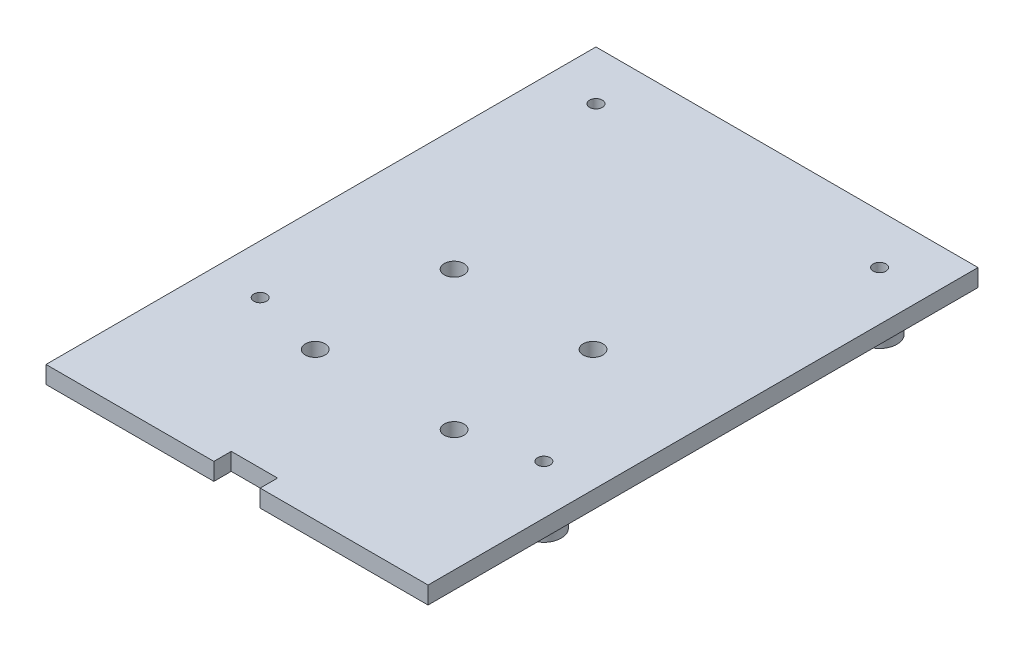
ISO-10303-21;
HEADER;
FILE_DESCRIPTION(('STEP AP214'),'2;1');
FILE_NAME('part.step','',(''),(''),'','','');
FILE_SCHEMA(('AUTOMOTIVE_DESIGN { 1 0 10303 214 1 1 1 1 }'));
ENDSEC;
DATA;
#1=APPLICATION_CONTEXT('core data for automotive mechanical design processes');
#2=APPLICATION_PROTOCOL_DEFINITION('international standard','automotive_design',2000,#1);
#3=PRODUCT_CONTEXT('',#1,'mechanical');
#4=PRODUCT('Part','Part','',(#3));
#5=PRODUCT_RELATED_PRODUCT_CATEGORY('part','',(#4));
#6=PRODUCT_DEFINITION_FORMATION('','',#4);
#7=PRODUCT_DEFINITION_CONTEXT('part definition',#1,'design');
#8=PRODUCT_DEFINITION('design','',#6,#7);
#9=PRODUCT_DEFINITION_SHAPE('','',#8);
#10=(LENGTH_UNIT() NAMED_UNIT(*) SI_UNIT(.MILLI.,.METRE.));
#11=(NAMED_UNIT(*) PLANE_ANGLE_UNIT() SI_UNIT($,.RADIAN.));
#12=(NAMED_UNIT(*) SI_UNIT($,.STERADIAN.) SOLID_ANGLE_UNIT());
#13=UNCERTAINTY_MEASURE_WITH_UNIT(LENGTH_MEASURE(1.E-05),#10,'distance_accuracy_value','');
#14=(GEOMETRIC_REPRESENTATION_CONTEXT(3) GLOBAL_UNCERTAINTY_ASSIGNED_CONTEXT((#13)) GLOBAL_UNIT_ASSIGNED_CONTEXT((#10,
#11,#12)) REPRESENTATION_CONTEXT('',''));
#15=CARTESIAN_POINT('',(0.,0.,0.));
#16=DIRECTION('',(0.,0.,1.));
#17=DIRECTION('',(1.,0.,0.));
#18=AXIS2_PLACEMENT_3D('',#15,#16,#17);
#19=CARTESIAN_POINT('',(-131.,-3.,37.5));
#20=DIRECTION('',(0.,0.,1.));
#21=DIRECTION('',(1.,0.,0.));
#22=AXIS2_PLACEMENT_3D('',#19,#20,#21);
#23=PLANE('',#22);
#24=DIRECTION('',(0.,-1.,0.));
#25=VECTOR('',#24,1.);
#26=CARTESIAN_POINT('',(-102.,-3.,37.5));
#27=LINE('',#26,#25);
#28=CARTESIAN_POINT('',(-102.,0.,37.5));
#29=VERTEX_POINT('',#28);
#30=CARTESIAN_POINT('',(-102.,-3.,37.5));
#31=VERTEX_POINT('',#30);
#32=EDGE_CURVE('E123',#29,#31,#27,.T.);
#33=ORIENTED_EDGE('',*,*,#32,.F.);
#34=DIRECTION('',(1.,0.,0.));
#35=VECTOR('',#34,1.);
#36=CARTESIAN_POINT('',(-131.,0.,37.5));
#37=LINE('',#36,#35);
#38=CARTESIAN_POINT('',(-131.,0.,37.5));
#39=VERTEX_POINT('',#38);
#40=EDGE_CURVE('E217',#39,#29,#37,.T.);
#41=ORIENTED_EDGE('',*,*,#40,.F.);
#42=DIRECTION('',(0.,1.,0.));
#43=VECTOR('',#42,1.);
#44=CARTESIAN_POINT('',(-131.,-3.,37.5));
#45=LINE('',#44,#43);
#46=CARTESIAN_POINT('',(-131.,-3.,37.5));
#47=VERTEX_POINT('',#46);
#48=EDGE_CURVE('E89',#47,#39,#45,.T.);
#49=ORIENTED_EDGE('',*,*,#48,.F.);
#50=DIRECTION('',(1.,0.,0.));
#51=VECTOR('',#50,1.);
#52=CARTESIAN_POINT('',(-131.,-3.,37.5));
#53=LINE('',#52,#51);
#54=EDGE_CURVE('E207',#47,#31,#53,.T.);
#55=ORIENTED_EDGE('',*,*,#54,.T.);
#56=EDGE_LOOP('',(#33,#41,#49,#55));
#57=FACE_BOUND('',#56,.T.);
#58=ADVANCED_FACE('F39',(#57),#23,.T.);
#59=CARTESIAN_POINT('',(-131.,-3.,-57.5));
#60=DIRECTION('',(-1.,0.,0.));
#61=DIRECTION('',(0.,0.,1.));
#62=AXIS2_PLACEMENT_3D('',#59,#60,#61);
#63=PLANE('',#62);
#64=DIRECTION('',(0.,0.,1.));
#65=VECTOR('',#64,1.);
#66=CARTESIAN_POINT('',(-131.,0.,-57.5));
#67=LINE('',#66,#65);
#68=CARTESIAN_POINT('',(-131.,0.,-57.5));
#69=VERTEX_POINT('',#68);
#70=EDGE_CURVE('E203',#69,#39,#67,.T.);
#71=ORIENTED_EDGE('',*,*,#70,.F.);
#72=DIRECTION('',(0.,1.,0.));
#73=VECTOR('',#72,1.);
#74=CARTESIAN_POINT('',(-131.,-3.,-57.5));
#75=LINE('',#74,#73);
#76=CARTESIAN_POINT('',(-131.,-3.,-57.5));
#77=VERTEX_POINT('',#76);
#78=EDGE_CURVE('E63',#77,#69,#75,.T.);
#79=ORIENTED_EDGE('',*,*,#78,.F.);
#80=DIRECTION('',(0.,0.,1.));
#81=VECTOR('',#80,1.);
#82=CARTESIAN_POINT('',(-131.,-3.,-57.5));
#83=LINE('',#82,#81);
#84=EDGE_CURVE('E204',#77,#47,#83,.T.);
#85=ORIENTED_EDGE('',*,*,#84,.T.);
#86=ORIENTED_EDGE('',*,*,#48,.T.);
#87=EDGE_LOOP('',(#71,#79,#85,#86));
#88=FACE_BOUND('',#87,.T.);
#89=ADVANCED_FACE('F41',(#88),#63,.T.);
#90=CARTESIAN_POINT('',(-131.,-3.,-57.5));
#91=DIRECTION('',(0.,0.,-1.));
#92=DIRECTION('',(-1.,0.,0.));
#93=AXIS2_PLACEMENT_3D('',#90,#91,#92);
#94=PLANE('',#93);
#95=DIRECTION('',(-1.,0.,0.));
#96=VECTOR('',#95,1.);
#97=CARTESIAN_POINT('',(-131.,0.,-57.5));
#98=LINE('',#97,#96);
#99=CARTESIAN_POINT('',(-65.,0.,-57.5));
#100=VERTEX_POINT('',#99);
#101=EDGE_CURVE('E206',#100,#69,#98,.T.);
#102=ORIENTED_EDGE('',*,*,#101,.F.);
#103=DIRECTION('',(0.,1.,0.));
#104=VECTOR('',#103,1.);
#105=CARTESIAN_POINT('',(-65.,-3.,-57.5));
#106=LINE('',#105,#104);
#107=CARTESIAN_POINT('',(-65.,-3.,-57.5));
#108=VERTEX_POINT('',#107);
#109=EDGE_CURVE('E226',#108,#100,#106,.T.);
#110=ORIENTED_EDGE('',*,*,#109,.F.);
#111=DIRECTION('',(-1.,0.,0.));
#112=VECTOR('',#111,1.);
#113=CARTESIAN_POINT('',(-131.,-3.,-57.5));
#114=LINE('',#113,#112);
#115=EDGE_CURVE('E212',#108,#77,#114,.T.);
#116=ORIENTED_EDGE('',*,*,#115,.T.);
#117=ORIENTED_EDGE('',*,*,#78,.T.);
#118=EDGE_LOOP('',(#102,#110,#116,#117));
#119=FACE_BOUND('',#118,.T.);
#120=ADVANCED_FACE('F250',(#119),#94,.T.);
#121=CARTESIAN_POINT('',(-65.,-3.,-57.5));
#122=DIRECTION('',(1.,0.,0.));
#123=DIRECTION('',(0.,0.,-1.));
#124=AXIS2_PLACEMENT_3D('',#121,#122,#123);
#125=PLANE('',#124);
#126=DIRECTION('',(0.,0.,-1.));
#127=VECTOR('',#126,1.);
#128=CARTESIAN_POINT('',(-65.,0.,-57.5));
#129=LINE('',#128,#127);
#130=CARTESIAN_POINT('',(-65.,0.,37.5));
#131=VERTEX_POINT('',#130);
#132=EDGE_CURVE('E220',#131,#100,#129,.T.);
#133=ORIENTED_EDGE('',*,*,#132,.F.);
#134=DIRECTION('',(0.,1.,0.));
#135=VECTOR('',#134,1.);
#136=CARTESIAN_POINT('',(-65.,-3.,37.5));
#137=LINE('',#136,#135);
#138=CARTESIAN_POINT('',(-65.,-3.,37.5));
#139=VERTEX_POINT('',#138);
#140=EDGE_CURVE('E228',#139,#131,#137,.T.);
#141=ORIENTED_EDGE('',*,*,#140,.F.);
#142=DIRECTION('',(0.,0.,-1.));
#143=VECTOR('',#142,1.);
#144=CARTESIAN_POINT('',(-65.,-3.,-57.5));
#145=LINE('',#144,#143);
#146=EDGE_CURVE('E209',#139,#108,#145,.T.);
#147=ORIENTED_EDGE('',*,*,#146,.T.);
#148=ORIENTED_EDGE('',*,*,#109,.T.);
#149=EDGE_LOOP('',(#133,#141,#147,#148));
#150=FACE_BOUND('',#149,.T.);
#151=ADVANCED_FACE('F253',(#150),#125,.T.);
#152=DIRECTION('',(0.,1.,0.));
#153=VECTOR('',#152,1.);
#154=CARTESIAN_POINT('',(-94.,-3.,37.5));
#155=LINE('',#154,#153);
#156=CARTESIAN_POINT('',(-94.,-3.,37.5));
#157=VERTEX_POINT('',#156);
#158=CARTESIAN_POINT('',(-94.,0.,37.5));
#159=VERTEX_POINT('',#158);
#160=EDGE_CURVE('E54',#157,#159,#155,.T.);
#161=ORIENTED_EDGE('',*,*,#160,.F.);
#162=EDGE_CURVE('E132',#157,#139,#53,.T.);
#163=ORIENTED_EDGE('',*,*,#162,.T.);
#164=ORIENTED_EDGE('',*,*,#140,.T.);
#165=EDGE_CURVE('E216',#159,#131,#37,.T.);
#166=ORIENTED_EDGE('',*,*,#165,.F.);
#167=EDGE_LOOP('',(#161,#163,#164,#166));
#168=FACE_BOUND('',#167,.T.);
#169=ADVANCED_FACE('F256',(#168),#23,.T.);
#170=CARTESIAN_POINT('',(0.,-3.,0.));
#171=DIRECTION('',(0.,1.,0.));
#172=DIRECTION('',(0.,0.,1.));
#173=AXIS2_PLACEMENT_3D('',#170,#171,#172);
#174=PLANE('',#173);
#175=CARTESIAN_POINT('',(-110.,-3.,12.));
#176=DIRECTION('',(0.,1.,0.));
#177=DIRECTION('',(0.,0.,1.));
#178=AXIS2_PLACEMENT_3D('',#175,#176,#177);
#179=CIRCLE('',#178,1.69999999999999);
#180=CARTESIAN_POINT('',(-110.,-3.,13.7));
#181=VERTEX_POINT('',#180);
#182=EDGE_CURVE('E176',#181,#181,#179,.T.);
#183=ORIENTED_EDGE('',*,*,#182,.T.);
#184=EDGE_LOOP('',(#183));
#185=FACE_BOUND('',#184,.T.);
#186=CARTESIAN_POINT('',(-86.,-3.,-12.));
#187=DIRECTION('',(0.,1.,0.));
#188=DIRECTION('',(0.,0.,1.));
#189=AXIS2_PLACEMENT_3D('',#186,#187,#188);
#190=CIRCLE('',#189,1.69999999999999);
#191=CARTESIAN_POINT('',(-86.,-3.,-10.3));
#192=VERTEX_POINT('',#191);
#193=EDGE_CURVE('E172',#192,#192,#190,.T.);
#194=ORIENTED_EDGE('',*,*,#193,.T.);
#195=EDGE_LOOP('',(#194));
#196=FACE_BOUND('',#195,.T.);
#197=CARTESIAN_POINT('',(-86.,-3.,12.));
#198=DIRECTION('',(0.,1.,0.));
#199=DIRECTION('',(0.,0.,1.));
#200=AXIS2_PLACEMENT_3D('',#197,#198,#199);
#201=CIRCLE('',#200,1.69999999999999);
#202=CARTESIAN_POINT('',(-86.,-3.,13.7));
#203=VERTEX_POINT('',#202);
#204=EDGE_CURVE('E168',#203,#203,#201,.T.);
#205=ORIENTED_EDGE('',*,*,#204,.T.);
#206=EDGE_LOOP('',(#205));
#207=FACE_BOUND('',#206,.T.);
#208=CARTESIAN_POINT('',(-110.,-3.,-12.));
#209=DIRECTION('',(0.,1.,0.));
#210=DIRECTION('',(0.,0.,1.));
#211=AXIS2_PLACEMENT_3D('',#208,#209,#210);
#212=CIRCLE('',#211,1.69999999999999);
#213=CARTESIAN_POINT('',(-110.,-3.,-10.3));
#214=VERTEX_POINT('',#213);
#215=EDGE_CURVE('E164',#214,#214,#212,.T.);
#216=ORIENTED_EDGE('',*,*,#215,.T.);
#217=EDGE_LOOP('',(#216));
#218=FACE_BOUND('',#217,.T.);
#219=CARTESIAN_POINT('',(-122.5,-3.,9.));
#220=DIRECTION('',(0.,1.,0.));
#221=DIRECTION('',(0.,0.,1.));
#222=AXIS2_PLACEMENT_3D('',#219,#220,#221);
#223=CIRCLE('',#222,3.);
#224=CARTESIAN_POINT('',(-122.5,-3.,12.));
#225=VERTEX_POINT('',#224);
#226=EDGE_CURVE('E200',#225,#225,#223,.T.);
#227=ORIENTED_EDGE('',*,*,#226,.T.);
#228=EDGE_LOOP('',(#227));
#229=FACE_BOUND('',#228,.T.);
#230=CARTESIAN_POINT('',(-73.5,-3.,-49.));
#231=DIRECTION('',(0.,1.,0.));
#232=DIRECTION('',(0.,0.,1.));
#233=AXIS2_PLACEMENT_3D('',#230,#231,#232);
#234=CIRCLE('',#233,3.);
#235=CARTESIAN_POINT('',(-73.5,-3.,-46.));
#236=VERTEX_POINT('',#235);
#237=EDGE_CURVE('E197',#236,#236,#234,.T.);
#238=ORIENTED_EDGE('',*,*,#237,.T.);
#239=EDGE_LOOP('',(#238));
#240=FACE_BOUND('',#239,.T.);
#241=CARTESIAN_POINT('',(-73.5,-3.,9.));
#242=DIRECTION('',(0.,1.,0.));
#243=DIRECTION('',(0.,0.,1.));
#244=AXIS2_PLACEMENT_3D('',#241,#242,#243);
#245=CIRCLE('',#244,3.);
#246=CARTESIAN_POINT('',(-73.5,-3.,12.));
#247=VERTEX_POINT('',#246);
#248=EDGE_CURVE('E194',#247,#247,#245,.T.);
#249=ORIENTED_EDGE('',*,*,#248,.T.);
#250=EDGE_LOOP('',(#249));
#251=FACE_BOUND('',#250,.T.);
#252=CARTESIAN_POINT('',(-122.5,-3.,-49.));
#253=DIRECTION('',(0.,1.,0.));
#254=DIRECTION('',(0.,0.,1.));
#255=AXIS2_PLACEMENT_3D('',#252,#253,#254);
#256=CIRCLE('',#255,3.);
#257=CARTESIAN_POINT('',(-122.5,-3.,-46.));
#258=VERTEX_POINT('',#257);
#259=EDGE_CURVE('E191',#258,#258,#256,.T.);
#260=ORIENTED_EDGE('',*,*,#259,.T.);
#261=EDGE_LOOP('',(#260));
#262=FACE_BOUND('',#261,.T.);
#263=DIRECTION('',(-1.,0.,0.));
#264=VECTOR('',#263,1.);
#265=CARTESIAN_POINT('',(0.,-3.,34.5));
#266=LINE('',#265,#264);
#267=CARTESIAN_POINT('',(-94.,-3.,34.5));
#268=VERTEX_POINT('',#267);
#269=CARTESIAN_POINT('',(-102.,-3.,34.5));
#270=VERTEX_POINT('',#269);
#271=EDGE_CURVE('E113',#268,#270,#266,.T.);
#272=ORIENTED_EDGE('',*,*,#271,.T.);
#273=DIRECTION('',(0.,0.,1.));
#274=VECTOR('',#273,1.);
#275=CARTESIAN_POINT('',(-102.,-3.,0.));
#276=LINE('',#275,#274);
#277=EDGE_CURVE('E137',#270,#31,#276,.T.);
#278=ORIENTED_EDGE('',*,*,#277,.T.);
#279=ORIENTED_EDGE('',*,*,#54,.F.);
#280=ORIENTED_EDGE('',*,*,#84,.F.);
#281=ORIENTED_EDGE('',*,*,#115,.F.);
#282=ORIENTED_EDGE('',*,*,#146,.F.);
#283=ORIENTED_EDGE('',*,*,#162,.F.);
#284=DIRECTION('',(0.,0.,-1.));
#285=VECTOR('',#284,1.);
#286=CARTESIAN_POINT('',(-94.,-3.,0.));
#287=LINE('',#286,#285);
#288=EDGE_CURVE('E124',#157,#268,#287,.T.);
#289=ORIENTED_EDGE('',*,*,#288,.T.);
#290=EDGE_LOOP('',(#272,#278,#279,#280,#281,#282,#283,#289));
#291=FACE_BOUND('',#290,.T.);
#292=ADVANCED_FACE('F130',(#185,#196,#207,#218,#229,#240,#251,#262,#291),#174,.F.);
#293=CARTESIAN_POINT('',(0.,0.,0.));
#294=DIRECTION('',(0.,1.,0.));
#295=DIRECTION('',(0.,0.,1.));
#296=AXIS2_PLACEMENT_3D('',#293,#294,#295);
#297=PLANE('',#296);
#298=DIRECTION('',(0.,0.,1.));
#299=VECTOR('',#298,1.);
#300=CARTESIAN_POINT('',(-102.,0.,0.));
#301=LINE('',#300,#299);
#302=CARTESIAN_POINT('',(-102.,0.,34.5));
#303=VERTEX_POINT('',#302);
#304=EDGE_CURVE('E11',#303,#29,#301,.T.);
#305=ORIENTED_EDGE('',*,*,#304,.F.);
#306=DIRECTION('',(-1.,0.,0.));
#307=VECTOR('',#306,1.);
#308=CARTESIAN_POINT('',(0.,0.,34.5));
#309=LINE('',#308,#307);
#310=CARTESIAN_POINT('',(-94.,0.,34.5));
#311=VERTEX_POINT('',#310);
#312=EDGE_CURVE('E47',#311,#303,#309,.T.);
#313=ORIENTED_EDGE('',*,*,#312,.F.);
#314=DIRECTION('',(0.,0.,-1.));
#315=VECTOR('',#314,1.);
#316=CARTESIAN_POINT('',(-94.,0.,0.));
#317=LINE('',#316,#315);
#318=EDGE_CURVE('E127',#159,#311,#317,.T.);
#319=ORIENTED_EDGE('',*,*,#318,.F.);
#320=ORIENTED_EDGE('',*,*,#165,.T.);
#321=ORIENTED_EDGE('',*,*,#132,.T.);
#322=ORIENTED_EDGE('',*,*,#101,.T.);
#323=ORIENTED_EDGE('',*,*,#70,.T.);
#324=ORIENTED_EDGE('',*,*,#40,.T.);
#325=EDGE_LOOP('',(#305,#313,#319,#320,#321,#322,#323,#324));
#326=FACE_BOUND('',#325,.T.);
#327=CARTESIAN_POINT('',(-110.,0.,12.));
#328=DIRECTION('',(0.,1.,0.));
#329=DIRECTION('',(0.,0.,1.));
#330=AXIS2_PLACEMENT_3D('',#327,#328,#329);
#331=CIRCLE('',#330,1.69999999999999);
#332=CARTESIAN_POINT('',(-110.,0.,13.7));
#333=VERTEX_POINT('',#332);
#334=EDGE_CURVE('E175',#333,#333,#331,.T.);
#335=ORIENTED_EDGE('',*,*,#334,.F.);
#336=EDGE_LOOP('',(#335));
#337=FACE_BOUND('',#336,.T.);
#338=CARTESIAN_POINT('',(-73.5,0.,9.));
#339=DIRECTION('',(0.,1.,0.));
#340=DIRECTION('',(0.,0.,1.));
#341=AXIS2_PLACEMENT_3D('',#338,#339,#340);
#342=CIRCLE('',#341,1.1);
#343=CARTESIAN_POINT('',(-73.5,0.,10.1));
#344=VERTEX_POINT('',#343);
#345=EDGE_CURVE('E157',#344,#344,#342,.T.);
#346=ORIENTED_EDGE('',*,*,#345,.F.);
#347=EDGE_LOOP('',(#346));
#348=FACE_BOUND('',#347,.T.);
#349=CARTESIAN_POINT('',(-73.5,0.,-49.));
#350=DIRECTION('',(0.,1.,0.));
#351=DIRECTION('',(0.,0.,1.));
#352=AXIS2_PLACEMENT_3D('',#349,#350,#351);
#353=CIRCLE('',#352,1.1);
#354=CARTESIAN_POINT('',(-73.5,0.,-47.9));
#355=VERTEX_POINT('',#354);
#356=EDGE_CURVE('E154',#355,#355,#353,.T.);
#357=ORIENTED_EDGE('',*,*,#356,.F.);
#358=EDGE_LOOP('',(#357));
#359=FACE_BOUND('',#358,.T.);
#360=CARTESIAN_POINT('',(-122.5,0.,9.));
#361=DIRECTION('',(0.,1.,0.));
#362=DIRECTION('',(0.,0.,1.));
#363=AXIS2_PLACEMENT_3D('',#360,#361,#362);
#364=CIRCLE('',#363,1.1);
#365=CARTESIAN_POINT('',(-122.5,0.,10.1));
#366=VERTEX_POINT('',#365);
#367=EDGE_CURVE('E151',#366,#366,#364,.T.);
#368=ORIENTED_EDGE('',*,*,#367,.F.);
#369=EDGE_LOOP('',(#368));
#370=FACE_BOUND('',#369,.T.);
#371=CARTESIAN_POINT('',(-86.,0.,-12.));
#372=DIRECTION('',(0.,1.,0.));
#373=DIRECTION('',(0.,0.,1.));
#374=AXIS2_PLACEMENT_3D('',#371,#372,#373);
#375=CIRCLE('',#374,1.69999999999999);
#376=CARTESIAN_POINT('',(-86.,0.,-10.3));
#377=VERTEX_POINT('',#376);
#378=EDGE_CURVE('E171',#377,#377,#375,.T.);
#379=ORIENTED_EDGE('',*,*,#378,.F.);
#380=EDGE_LOOP('',(#379));
#381=FACE_BOUND('',#380,.T.);
#382=CARTESIAN_POINT('',(-86.,0.,12.));
#383=DIRECTION('',(0.,1.,0.));
#384=DIRECTION('',(0.,0.,1.));
#385=AXIS2_PLACEMENT_3D('',#382,#383,#384);
#386=CIRCLE('',#385,1.69999999999999);
#387=CARTESIAN_POINT('',(-86.,0.,13.7));
#388=VERTEX_POINT('',#387);
#389=EDGE_CURVE('E167',#388,#388,#386,.T.);
#390=ORIENTED_EDGE('',*,*,#389,.F.);
#391=EDGE_LOOP('',(#390));
#392=FACE_BOUND('',#391,.T.);
#393=CARTESIAN_POINT('',(-110.,0.,-12.));
#394=DIRECTION('',(0.,1.,0.));
#395=DIRECTION('',(0.,0.,1.));
#396=AXIS2_PLACEMENT_3D('',#393,#394,#395);
#397=CIRCLE('',#396,1.69999999999999);
#398=CARTESIAN_POINT('',(-110.,0.,-10.3));
#399=VERTEX_POINT('',#398);
#400=EDGE_CURVE('E163',#399,#399,#397,.T.);
#401=ORIENTED_EDGE('',*,*,#400,.F.);
#402=EDGE_LOOP('',(#401));
#403=FACE_BOUND('',#402,.T.);
#404=CARTESIAN_POINT('',(-122.5,0.,-49.));
#405=DIRECTION('',(0.,1.,0.));
#406=DIRECTION('',(0.,0.,1.));
#407=AXIS2_PLACEMENT_3D('',#404,#405,#406);
#408=CIRCLE('',#407,1.1);
#409=CARTESIAN_POINT('',(-122.5,0.,-47.9));
#410=VERTEX_POINT('',#409);
#411=EDGE_CURVE('E160',#410,#410,#408,.T.);
#412=ORIENTED_EDGE('',*,*,#411,.F.);
#413=EDGE_LOOP('',(#412));
#414=FACE_BOUND('',#413,.T.);
#415=ADVANCED_FACE('F246',(#326,#337,#348,#359,#370,#381,#392,#403,#414),#297,.T.);
#416=CARTESIAN_POINT('',(-122.5,-10.,-49.));
#417=DIRECTION('',(0.,1.,0.));
#418=DIRECTION('',(0.,0.,1.));
#419=AXIS2_PLACEMENT_3D('',#416,#417,#418);
#420=CYLINDRICAL_SURFACE('',#419,3.);
#421=CARTESIAN_POINT('',(-122.5,-10.,-49.));
#422=DIRECTION('',(0.,1.,0.));
#423=DIRECTION('',(0.,0.,1.));
#424=AXIS2_PLACEMENT_3D('',#421,#422,#423);
#425=CIRCLE('',#424,3.);
#426=CARTESIAN_POINT('',(-122.5,-10.,-46.));
#427=VERTEX_POINT('',#426);
#428=EDGE_CURVE('E186',#427,#427,#425,.T.);
#429=ORIENTED_EDGE('',*,*,#428,.T.);
#430=EDGE_LOOP('',(#429));
#431=FACE_BOUND('',#430,.T.);
#432=ORIENTED_EDGE('',*,*,#259,.F.);
#433=EDGE_LOOP('',(#432));
#434=FACE_BOUND('',#433,.T.);
#435=ADVANCED_FACE('F278',(#431,#434),#420,.T.);
#436=CARTESIAN_POINT('',(-122.5,-10.,-49.));
#437=DIRECTION('',(0.,1.,0.));
#438=DIRECTION('',(0.,0.,1.));
#439=AXIS2_PLACEMENT_3D('',#436,#437,#438);
#440=PLANE('',#439);
#441=CARTESIAN_POINT('',(-122.5,-10.,-49.));
#442=DIRECTION('',(0.,1.,0.));
#443=DIRECTION('',(0.,0.,1.));
#444=AXIS2_PLACEMENT_3D('',#441,#442,#443);
#445=CIRCLE('',#444,1.1);
#446=CARTESIAN_POINT('',(-122.5,-10.,-47.9));
#447=VERTEX_POINT('',#446);
#448=EDGE_CURVE('E146',#447,#447,#445,.T.);
#449=ORIENTED_EDGE('',*,*,#448,.T.);
#450=EDGE_LOOP('',(#449));
#451=FACE_BOUND('',#450,.T.);
#452=ORIENTED_EDGE('',*,*,#428,.F.);
#453=EDGE_LOOP('',(#452));
#454=FACE_BOUND('',#453,.T.);
#455=ADVANCED_FACE('F282',(#451,#454),#440,.F.);
#456=CARTESIAN_POINT('',(-73.5,-10.,9.));
#457=DIRECTION('',(0.,1.,0.));
#458=DIRECTION('',(0.,0.,1.));
#459=AXIS2_PLACEMENT_3D('',#456,#457,#458);
#460=CYLINDRICAL_SURFACE('',#459,3.);
#461=CARTESIAN_POINT('',(-73.5,-10.,9.));
#462=DIRECTION('',(0.,1.,0.));
#463=DIRECTION('',(0.,0.,1.));
#464=AXIS2_PLACEMENT_3D('',#461,#462,#463);
#465=CIRCLE('',#464,3.);
#466=CARTESIAN_POINT('',(-73.5,-10.,12.));
#467=VERTEX_POINT('',#466);
#468=EDGE_CURVE('E179',#467,#467,#465,.T.);
#469=ORIENTED_EDGE('',*,*,#468,.T.);
#470=EDGE_LOOP('',(#469));
#471=FACE_BOUND('',#470,.T.);
#472=ORIENTED_EDGE('',*,*,#248,.F.);
#473=EDGE_LOOP('',(#472));
#474=FACE_BOUND('',#473,.T.);
#475=ADVANCED_FACE('F286',(#471,#474),#460,.T.);
#476=CARTESIAN_POINT('',(-73.5,-10.,9.));
#477=DIRECTION('',(0.,1.,0.));
#478=DIRECTION('',(0.,0.,1.));
#479=AXIS2_PLACEMENT_3D('',#476,#477,#478);
#480=PLANE('',#479);
#481=CARTESIAN_POINT('',(-73.5,-10.,9.));
#482=DIRECTION('',(0.,1.,0.));
#483=DIRECTION('',(0.,0.,1.));
#484=AXIS2_PLACEMENT_3D('',#481,#482,#483);
#485=CIRCLE('',#484,1.1);
#486=CARTESIAN_POINT('',(-73.5,-10.,10.1));
#487=VERTEX_POINT('',#486);
#488=EDGE_CURVE('E139',#487,#487,#485,.T.);
#489=ORIENTED_EDGE('',*,*,#488,.T.);
#490=EDGE_LOOP('',(#489));
#491=FACE_BOUND('',#490,.T.);
#492=ORIENTED_EDGE('',*,*,#468,.F.);
#493=EDGE_LOOP('',(#492));
#494=FACE_BOUND('',#493,.T.);
#495=ADVANCED_FACE('F296',(#491,#494),#480,.F.);
#496=CARTESIAN_POINT('',(-73.5,-10.,-49.));
#497=DIRECTION('',(0.,1.,0.));
#498=DIRECTION('',(0.,0.,1.));
#499=AXIS2_PLACEMENT_3D('',#496,#497,#498);
#500=CYLINDRICAL_SURFACE('',#499,3.);
#501=CARTESIAN_POINT('',(-73.5,-10.,-49.));
#502=DIRECTION('',(0.,1.,0.));
#503=DIRECTION('',(0.,0.,1.));
#504=AXIS2_PLACEMENT_3D('',#501,#502,#503);
#505=CIRCLE('',#504,3.);
#506=CARTESIAN_POINT('',(-73.5,-10.,-46.));
#507=VERTEX_POINT('',#506);
#508=EDGE_CURVE('E182',#507,#507,#505,.T.);
#509=ORIENTED_EDGE('',*,*,#508,.T.);
#510=EDGE_LOOP('',(#509));
#511=FACE_BOUND('',#510,.T.);
#512=ORIENTED_EDGE('',*,*,#237,.F.);
#513=EDGE_LOOP('',(#512));
#514=FACE_BOUND('',#513,.T.);
#515=ADVANCED_FACE('F292',(#511,#514),#500,.T.);
#516=CARTESIAN_POINT('',(-73.5,-10.,-49.));
#517=DIRECTION('',(0.,1.,0.));
#518=DIRECTION('',(0.,0.,1.));
#519=AXIS2_PLACEMENT_3D('',#516,#517,#518);
#520=PLANE('',#519);
#521=CARTESIAN_POINT('',(-73.5,-10.,-49.));
#522=DIRECTION('',(0.,1.,0.));
#523=DIRECTION('',(0.,0.,1.));
#524=AXIS2_PLACEMENT_3D('',#521,#522,#523);
#525=CIRCLE('',#524,1.1);
#526=CARTESIAN_POINT('',(-73.5,-10.,-47.9));
#527=VERTEX_POINT('',#526);
#528=EDGE_CURVE('E142',#527,#527,#525,.T.);
#529=ORIENTED_EDGE('',*,*,#528,.T.);
#530=EDGE_LOOP('',(#529));
#531=FACE_BOUND('',#530,.T.);
#532=ORIENTED_EDGE('',*,*,#508,.F.);
#533=EDGE_LOOP('',(#532));
#534=FACE_BOUND('',#533,.T.);
#535=ADVANCED_FACE('F288',(#531,#534),#520,.F.);
#536=CARTESIAN_POINT('',(-122.5,-10.,9.));
#537=DIRECTION('',(0.,1.,0.));
#538=DIRECTION('',(0.,0.,1.));
#539=AXIS2_PLACEMENT_3D('',#536,#537,#538);
#540=CYLINDRICAL_SURFACE('',#539,3.);
#541=CARTESIAN_POINT('',(-122.5,-10.,9.));
#542=DIRECTION('',(0.,1.,0.));
#543=DIRECTION('',(0.,0.,1.));
#544=AXIS2_PLACEMENT_3D('',#541,#542,#543);
#545=CIRCLE('',#544,3.);
#546=CARTESIAN_POINT('',(-122.5,-10.,12.));
#547=VERTEX_POINT('',#546);
#548=EDGE_CURVE('E183',#547,#547,#545,.T.);
#549=ORIENTED_EDGE('',*,*,#548,.T.);
#550=EDGE_LOOP('',(#549));
#551=FACE_BOUND('',#550,.T.);
#552=ORIENTED_EDGE('',*,*,#226,.F.);
#553=EDGE_LOOP('',(#552));
#554=FACE_BOUND('',#553,.T.);
#555=ADVANCED_FACE('F291',(#551,#554),#540,.T.);
#556=CARTESIAN_POINT('',(-122.5,-10.,9.));
#557=DIRECTION('',(0.,1.,0.));
#558=DIRECTION('',(0.,0.,1.));
#559=AXIS2_PLACEMENT_3D('',#556,#557,#558);
#560=PLANE('',#559);
#561=CARTESIAN_POINT('',(-122.5,-10.,9.));
#562=DIRECTION('',(0.,1.,0.));
#563=DIRECTION('',(0.,0.,1.));
#564=AXIS2_PLACEMENT_3D('',#561,#562,#563);
#565=CIRCLE('',#564,1.1);
#566=CARTESIAN_POINT('',(-122.5,-10.,10.1));
#567=VERTEX_POINT('',#566);
#568=EDGE_CURVE('E143',#567,#567,#565,.T.);
#569=ORIENTED_EDGE('',*,*,#568,.T.);
#570=EDGE_LOOP('',(#569));
#571=FACE_BOUND('',#570,.T.);
#572=ORIENTED_EDGE('',*,*,#548,.F.);
#573=EDGE_LOOP('',(#572));
#574=FACE_BOUND('',#573,.T.);
#575=ADVANCED_FACE('F298',(#571,#574),#560,.F.);
#576=CARTESIAN_POINT('',(-122.5,-10.,9.));
#577=DIRECTION('',(0.,1.,0.));
#578=DIRECTION('',(0.,0.,1.));
#579=AXIS2_PLACEMENT_3D('',#576,#577,#578);
#580=CYLINDRICAL_SURFACE('',#579,1.1);
#581=ORIENTED_EDGE('',*,*,#367,.T.);
#582=EDGE_LOOP('',(#581));
#583=FACE_BOUND('',#582,.T.);
#584=ORIENTED_EDGE('',*,*,#568,.F.);
#585=EDGE_LOOP('',(#584));
#586=FACE_BOUND('',#585,.T.);
#587=ADVANCED_FACE('F301',(#583,#586),#580,.F.);
#588=CARTESIAN_POINT('',(-73.5,-10.,-49.));
#589=DIRECTION('',(0.,1.,0.));
#590=DIRECTION('',(0.,0.,1.));
#591=AXIS2_PLACEMENT_3D('',#588,#589,#590);
#592=CYLINDRICAL_SURFACE('',#591,1.1);
#593=ORIENTED_EDGE('',*,*,#356,.T.);
#594=EDGE_LOOP('',(#593));
#595=FACE_BOUND('',#594,.T.);
#596=ORIENTED_EDGE('',*,*,#528,.F.);
#597=EDGE_LOOP('',(#596));
#598=FACE_BOUND('',#597,.T.);
#599=ADVANCED_FACE('F318',(#595,#598),#592,.F.);
#600=CARTESIAN_POINT('',(-73.5,-10.,9.));
#601=DIRECTION('',(0.,1.,0.));
#602=DIRECTION('',(0.,0.,1.));
#603=AXIS2_PLACEMENT_3D('',#600,#601,#602);
#604=CYLINDRICAL_SURFACE('',#603,1.1);
#605=ORIENTED_EDGE('',*,*,#345,.T.);
#606=EDGE_LOOP('',(#605));
#607=FACE_BOUND('',#606,.T.);
#608=ORIENTED_EDGE('',*,*,#488,.F.);
#609=EDGE_LOOP('',(#608));
#610=FACE_BOUND('',#609,.T.);
#611=ADVANCED_FACE('F316',(#607,#610),#604,.F.);
#612=CARTESIAN_POINT('',(-122.5,-10.,-49.));
#613=DIRECTION('',(0.,1.,0.));
#614=DIRECTION('',(0.,0.,1.));
#615=AXIS2_PLACEMENT_3D('',#612,#613,#614);
#616=CYLINDRICAL_SURFACE('',#615,1.1);
#617=ORIENTED_EDGE('',*,*,#411,.T.);
#618=EDGE_LOOP('',(#617));
#619=FACE_BOUND('',#618,.T.);
#620=ORIENTED_EDGE('',*,*,#448,.F.);
#621=EDGE_LOOP('',(#620));
#622=FACE_BOUND('',#621,.T.);
#623=ADVANCED_FACE('F312',(#619,#622),#616,.F.);
#624=CARTESIAN_POINT('',(-110.,-10.,-12.));
#625=DIRECTION('',(0.,1.,0.));
#626=DIRECTION('',(0.,0.,1.));
#627=AXIS2_PLACEMENT_3D('',#624,#625,#626);
#628=CYLINDRICAL_SURFACE('',#627,1.69999999999999);
#629=ORIENTED_EDGE('',*,*,#400,.T.);
#630=EDGE_LOOP('',(#629));
#631=FACE_BOUND('',#630,.T.);
#632=ORIENTED_EDGE('',*,*,#215,.F.);
#633=EDGE_LOOP('',(#632));
#634=FACE_BOUND('',#633,.T.);
#635=ADVANCED_FACE('F315',(#631,#634),#628,.F.);
#636=CARTESIAN_POINT('',(-86.,-10.,12.));
#637=DIRECTION('',(0.,1.,0.));
#638=DIRECTION('',(0.,0.,1.));
#639=AXIS2_PLACEMENT_3D('',#636,#637,#638);
#640=CYLINDRICAL_SURFACE('',#639,1.69999999999999);
#641=ORIENTED_EDGE('',*,*,#389,.T.);
#642=EDGE_LOOP('',(#641));
#643=FACE_BOUND('',#642,.T.);
#644=ORIENTED_EDGE('',*,*,#204,.F.);
#645=EDGE_LOOP('',(#644));
#646=FACE_BOUND('',#645,.T.);
#647=ADVANCED_FACE('F332',(#643,#646),#640,.F.);
#648=CARTESIAN_POINT('',(-86.,-10.,-12.));
#649=DIRECTION('',(0.,1.,0.));
#650=DIRECTION('',(0.,0.,1.));
#651=AXIS2_PLACEMENT_3D('',#648,#649,#650);
#652=CYLINDRICAL_SURFACE('',#651,1.69999999999999);
#653=ORIENTED_EDGE('',*,*,#378,.T.);
#654=EDGE_LOOP('',(#653));
#655=FACE_BOUND('',#654,.T.);
#656=ORIENTED_EDGE('',*,*,#193,.F.);
#657=EDGE_LOOP('',(#656));
#658=FACE_BOUND('',#657,.T.);
#659=ADVANCED_FACE('F327',(#655,#658),#652,.F.);
#660=CARTESIAN_POINT('',(-110.,-10.,12.));
#661=DIRECTION('',(0.,1.,0.));
#662=DIRECTION('',(0.,0.,1.));
#663=AXIS2_PLACEMENT_3D('',#660,#661,#662);
#664=CYLINDRICAL_SURFACE('',#663,1.69999999999999);
#665=ORIENTED_EDGE('',*,*,#334,.T.);
#666=EDGE_LOOP('',(#665));
#667=FACE_BOUND('',#666,.T.);
#668=ORIENTED_EDGE('',*,*,#182,.F.);
#669=EDGE_LOOP('',(#668));
#670=FACE_BOUND('',#669,.T.);
#671=ADVANCED_FACE('F325',(#667,#670),#664,.F.);
#672=CARTESIAN_POINT('',(-102.,-10.,34.5));
#673=DIRECTION('',(-1.,0.,0.));
#674=DIRECTION('',(0.,0.,1.));
#675=AXIS2_PLACEMENT_3D('',#672,#673,#674);
#676=PLANE('',#675);
#677=DIRECTION('',(0.,1.,0.));
#678=VECTOR('',#677,1.);
#679=CARTESIAN_POINT('',(-102.,-10.,34.5));
#680=LINE('',#679,#678);
#681=EDGE_CURVE('E119',#270,#303,#680,.T.);
#682=ORIENTED_EDGE('',*,*,#681,.T.);
#683=ORIENTED_EDGE('',*,*,#304,.T.);
#684=ORIENTED_EDGE('',*,*,#32,.T.);
#685=ORIENTED_EDGE('',*,*,#277,.F.);
#686=EDGE_LOOP('',(#682,#683,#684,#685));
#687=FACE_BOUND('',#686,.T.);
#688=ADVANCED_FACE('F243',(#687),#676,.F.);
#689=CARTESIAN_POINT('',(-102.,-10.,34.5));
#690=DIRECTION('',(0.,0.,-1.));
#691=DIRECTION('',(-1.,0.,0.));
#692=AXIS2_PLACEMENT_3D('',#689,#690,#691);
#693=PLANE('',#692);
#694=DIRECTION('',(0.,1.,0.));
#695=VECTOR('',#694,1.);
#696=CARTESIAN_POINT('',(-94.,-10.,34.5));
#697=LINE('',#696,#695);
#698=EDGE_CURVE('E116',#268,#311,#697,.T.);
#699=ORIENTED_EDGE('',*,*,#698,.T.);
#700=ORIENTED_EDGE('',*,*,#312,.T.);
#701=ORIENTED_EDGE('',*,*,#681,.F.);
#702=ORIENTED_EDGE('',*,*,#271,.F.);
#703=EDGE_LOOP('',(#699,#700,#701,#702));
#704=FACE_BOUND('',#703,.T.);
#705=ADVANCED_FACE('F115',(#704),#693,.F.);
#706=CARTESIAN_POINT('',(-94.,-10.,34.5));
#707=DIRECTION('',(1.,0.,0.));
#708=DIRECTION('',(0.,0.,-1.));
#709=AXIS2_PLACEMENT_3D('',#706,#707,#708);
#710=PLANE('',#709);
#711=ORIENTED_EDGE('',*,*,#160,.T.);
#712=ORIENTED_EDGE('',*,*,#318,.T.);
#713=ORIENTED_EDGE('',*,*,#698,.F.);
#714=ORIENTED_EDGE('',*,*,#288,.F.);
#715=EDGE_LOOP('',(#711,#712,#713,#714));
#716=FACE_BOUND('',#715,.T.);
#717=ADVANCED_FACE('F126',(#716),#710,.F.);
#718=CLOSED_SHELL('',(#58,#89,#120,#151,#169,#292,#415,#435,#455,#475,#495,#515,#535,#555,#575,
#587,#599,#611,#623,#635,#647,#659,#671,#688,#705,#717));
#719=MANIFOLD_SOLID_BREP('B2',#718);
#720=ADVANCED_BREP_SHAPE_REPRESENTATION('',(#18,#719),#14);
#721=SHAPE_DEFINITION_REPRESENTATION(#9,#720);
ENDSEC;
END-ISO-10303-21;
